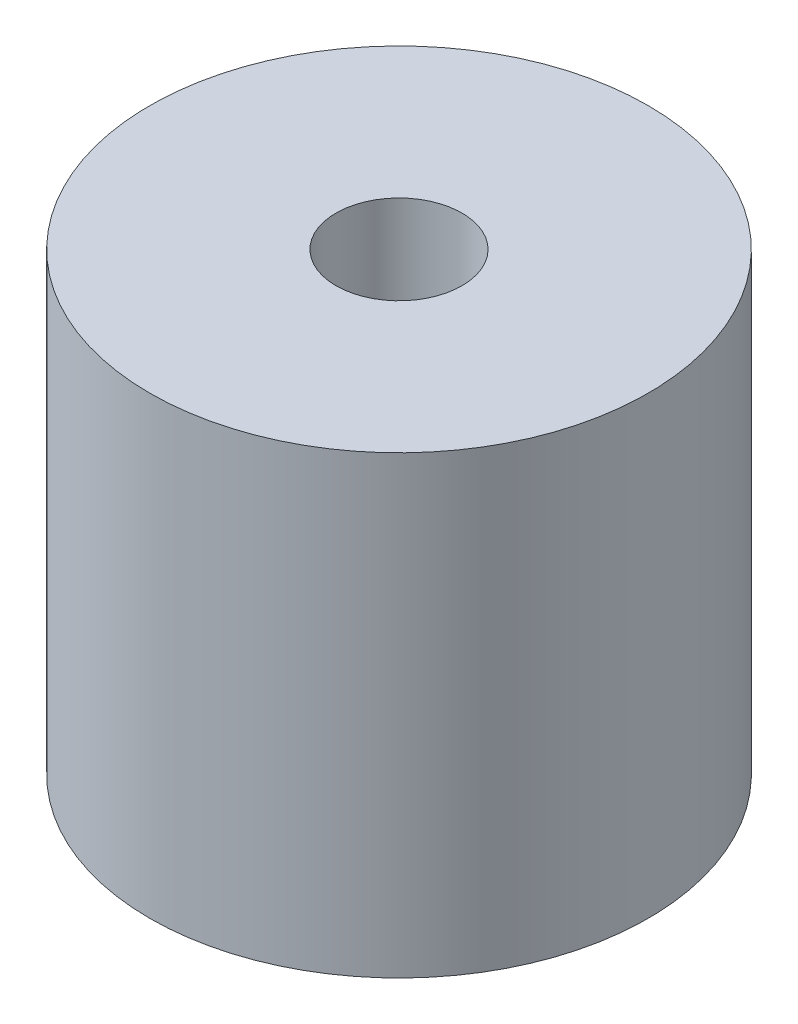
ISO-10303-21;
HEADER;
FILE_DESCRIPTION(('STEP AP214'),'2;1');
FILE_NAME('part.step','',(''),(''),'','','');
FILE_SCHEMA(('AUTOMOTIVE_DESIGN { 1 0 10303 214 1 1 1 1 }'));
ENDSEC;
DATA;
#1=APPLICATION_CONTEXT('core data for automotive mechanical design processes');
#2=APPLICATION_PROTOCOL_DEFINITION('international standard','automotive_design',2000,#1);
#3=PRODUCT_CONTEXT('',#1,'mechanical');
#4=PRODUCT('Part','Part','',(#3));
#5=PRODUCT_RELATED_PRODUCT_CATEGORY('part','',(#4));
#6=PRODUCT_DEFINITION_FORMATION('','',#4);
#7=PRODUCT_DEFINITION_CONTEXT('part definition',#1,'design');
#8=PRODUCT_DEFINITION('design','',#6,#7);
#9=PRODUCT_DEFINITION_SHAPE('','',#8);
#10=(LENGTH_UNIT() NAMED_UNIT(*) SI_UNIT(.MILLI.,.METRE.));
#11=(NAMED_UNIT(*) PLANE_ANGLE_UNIT() SI_UNIT($,.RADIAN.));
#12=(NAMED_UNIT(*) SI_UNIT($,.STERADIAN.) SOLID_ANGLE_UNIT());
#13=UNCERTAINTY_MEASURE_WITH_UNIT(LENGTH_MEASURE(1.E-05),#10,'distance_accuracy_value','');
#14=(GEOMETRIC_REPRESENTATION_CONTEXT(3) GLOBAL_UNCERTAINTY_ASSIGNED_CONTEXT((#13)) GLOBAL_UNIT_ASSIGNED_CONTEXT((#10,
#11,#12)) REPRESENTATION_CONTEXT('',''));
#15=CARTESIAN_POINT('',(0.,0.,0.));
#16=DIRECTION('',(0.,0.,1.));
#17=DIRECTION('',(1.,0.,0.));
#18=AXIS2_PLACEMENT_3D('',#15,#16,#17);
#19=CARTESIAN_POINT('',(0.,8.1153,0.));
#20=DIRECTION('',(0.,-1.,0.));
#21=DIRECTION('',(0.,0.,-1.));
#22=AXIS2_PLACEMENT_3D('',#19,#20,#21);
#23=CYLINDRICAL_SURFACE('',#22,8.89);
#24=CARTESIAN_POINT('',(0.,8.1153,0.));
#25=DIRECTION('',(0.,1.,0.));
#26=DIRECTION('',(0.,0.,1.));
#27=AXIS2_PLACEMENT_3D('',#24,#25,#26);
#28=CIRCLE('',#27,8.89);
#29=CARTESIAN_POINT('',(0.,8.1153,8.89));
#30=VERTEX_POINT('',#29);
#31=EDGE_CURVE('E10',#30,#30,#28,.T.);
#32=ORIENTED_EDGE('',*,*,#31,.F.);
#33=EDGE_LOOP('',(#32));
#34=FACE_BOUND('',#33,.T.);
#35=CARTESIAN_POINT('',(0.,-8.1153,0.));
#36=DIRECTION('',(0.,1.,0.));
#37=DIRECTION('',(0.,0.,1.));
#38=AXIS2_PLACEMENT_3D('',#35,#36,#37);
#39=CIRCLE('',#38,8.89);
#40=CARTESIAN_POINT('',(0.,-8.1153,8.89));
#41=VERTEX_POINT('',#40);
#42=EDGE_CURVE('E40',#41,#41,#39,.T.);
#43=ORIENTED_EDGE('',*,*,#42,.T.);
#44=EDGE_LOOP('',(#43));
#45=FACE_BOUND('',#44,.T.);
#46=ADVANCED_FACE('F37',(#34,#45),#23,.T.);
#47=CARTESIAN_POINT('',(0.,8.1153,0.));
#48=DIRECTION('',(0.,1.,0.));
#49=DIRECTION('',(0.,0.,1.));
#50=AXIS2_PLACEMENT_3D('',#47,#48,#49);
#51=PLANE('',#50);
#52=CARTESIAN_POINT('',(0.,8.1153,0.));
#53=DIRECTION('',(0.,1.,0.));
#54=DIRECTION('',(0.,0.,1.));
#55=AXIS2_PLACEMENT_3D('',#52,#53,#54);
#56=CIRCLE('',#55,2.2479);
#57=CARTESIAN_POINT('',(0.,8.1153,2.2479));
#58=VERTEX_POINT('',#57);
#59=EDGE_CURVE('E49',#58,#58,#56,.T.);
#60=ORIENTED_EDGE('',*,*,#59,.F.);
#61=EDGE_LOOP('',(#60));
#62=FACE_BOUND('',#61,.T.);
#63=ORIENTED_EDGE('',*,*,#31,.T.);
#64=EDGE_LOOP('',(#63));
#65=FACE_BOUND('',#64,.T.);
#66=ADVANCED_FACE('F69',(#62,#65),#51,.T.);
#67=CARTESIAN_POINT('',(0.,-8.1153,0.));
#68=DIRECTION('',(0.,1.,0.));
#69=DIRECTION('',(0.,0.,1.));
#70=AXIS2_PLACEMENT_3D('',#67,#68,#69);
#71=PLANE('',#70);
#72=CARTESIAN_POINT('',(0.,-8.1153,0.));
#73=DIRECTION('',(0.,1.,0.));
#74=DIRECTION('',(0.,0.,1.));
#75=AXIS2_PLACEMENT_3D('',#72,#73,#74);
#76=CIRCLE('',#75,2.2479);
#77=CARTESIAN_POINT('',(0.,-8.1153,2.2479));
#78=VERTEX_POINT('',#77);
#79=EDGE_CURVE('E54',#78,#78,#76,.T.);
#80=ORIENTED_EDGE('',*,*,#79,.T.);
#81=EDGE_LOOP('',(#80));
#82=FACE_BOUND('',#81,.T.);
#83=ORIENTED_EDGE('',*,*,#42,.F.);
#84=EDGE_LOOP('',(#83));
#85=FACE_BOUND('',#84,.T.);
#86=ADVANCED_FACE('F59',(#82,#85),#71,.F.);
#87=CARTESIAN_POINT('',(0.,-8.1153,0.));
#88=DIRECTION('',(0.,1.,0.));
#89=DIRECTION('',(0.,0.,1.));
#90=AXIS2_PLACEMENT_3D('',#87,#88,#89);
#91=CYLINDRICAL_SURFACE('',#90,2.2479);
#92=ORIENTED_EDGE('',*,*,#59,.T.);
#93=EDGE_LOOP('',(#92));
#94=FACE_BOUND('',#93,.T.);
#95=ORIENTED_EDGE('',*,*,#79,.F.);
#96=EDGE_LOOP('',(#95));
#97=FACE_BOUND('',#96,.T.);
#98=ADVANCED_FACE('F62',(#94,#97),#91,.F.);
#99=CLOSED_SHELL('',(#46,#66,#86,#98));
#100=MANIFOLD_SOLID_BREP('B2',#99);
#101=ADVANCED_BREP_SHAPE_REPRESENTATION('',(#18,#100),#14);
#102=SHAPE_DEFINITION_REPRESENTATION(#9,#101);
ENDSEC;
END-ISO-10303-21;
